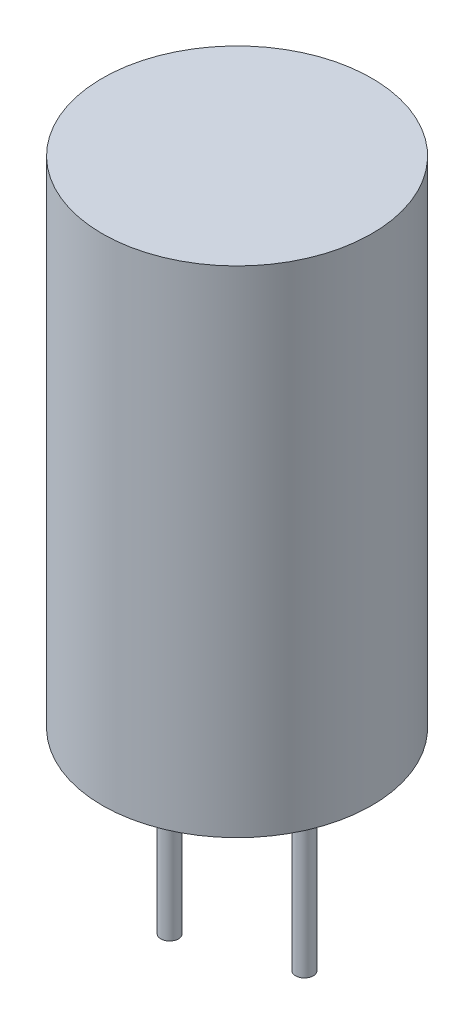
ISO-10303-21;
HEADER;
FILE_DESCRIPTION(('STEP AP214'),'2;1');
FILE_NAME('part.step','',(''),(''),'','','');
FILE_SCHEMA(('AUTOMOTIVE_DESIGN { 1 0 10303 214 1 1 1 1 }'));
ENDSEC;
DATA;
#1=APPLICATION_CONTEXT('core data for automotive mechanical design processes');
#2=APPLICATION_PROTOCOL_DEFINITION('international standard','automotive_design',2000,#1);
#3=PRODUCT_CONTEXT('',#1,'mechanical');
#4=PRODUCT('Part','Part','',(#3));
#5=PRODUCT_RELATED_PRODUCT_CATEGORY('part','',(#4));
#6=PRODUCT_DEFINITION_FORMATION('','',#4);
#7=PRODUCT_DEFINITION_CONTEXT('part definition',#1,'design');
#8=PRODUCT_DEFINITION('design','',#6,#7);
#9=PRODUCT_DEFINITION_SHAPE('','',#8);
#10=(LENGTH_UNIT() NAMED_UNIT(*) SI_UNIT(.MILLI.,.METRE.));
#11=(NAMED_UNIT(*) PLANE_ANGLE_UNIT() SI_UNIT($,.RADIAN.));
#12=(NAMED_UNIT(*) SI_UNIT($,.STERADIAN.) SOLID_ANGLE_UNIT());
#13=UNCERTAINTY_MEASURE_WITH_UNIT(LENGTH_MEASURE(1.E-05),#10,'distance_accuracy_value','');
#14=(GEOMETRIC_REPRESENTATION_CONTEXT(3) GLOBAL_UNCERTAINTY_ASSIGNED_CONTEXT((#13)) GLOBAL_UNIT_ASSIGNED_CONTEXT((#10,
#11,#12)) REPRESENTATION_CONTEXT('',''));
#15=CARTESIAN_POINT('',(0.,0.,0.));
#16=DIRECTION('',(0.,0.,1.));
#17=DIRECTION('',(1.,0.,0.));
#18=AXIS2_PLACEMENT_3D('',#15,#16,#17);
#19=CARTESIAN_POINT('',(0.,0.,0.));
#20=DIRECTION('',(0.,1.,0.));
#21=DIRECTION('',(0.,0.,1.));
#22=AXIS2_PLACEMENT_3D('',#19,#20,#21);
#23=PLANE('',#22);
#24=CARTESIAN_POINT('',(-3.81,0.,0.));
#25=DIRECTION('',(0.,1.,0.));
#26=DIRECTION('',(0.,0.,1.));
#27=AXIS2_PLACEMENT_3D('',#24,#25,#26);
#28=CIRCLE('',#27,0.499999999999999);
#29=CARTESIAN_POINT('',(-3.81,0.,0.499999999999999));
#30=VERTEX_POINT('',#29);
#31=EDGE_CURVE('E34',#30,#30,#28,.F.);
#32=ORIENTED_EDGE('',*,*,#31,.F.);
#33=EDGE_LOOP('',(#32));
#34=FACE_BOUND('',#33,.T.);
#35=CARTESIAN_POINT('',(0.,0.,0.));
#36=DIRECTION('',(0.,1.,0.));
#37=DIRECTION('',(0.,0.,1.));
#38=AXIS2_PLACEMENT_3D('',#35,#36,#37);
#39=CIRCLE('',#38,7.62);
#40=CARTESIAN_POINT('',(0.,0.,7.62));
#41=VERTEX_POINT('',#40);
#42=EDGE_CURVE('E42',#41,#41,#39,.T.);
#43=ORIENTED_EDGE('',*,*,#42,.F.);
#44=EDGE_LOOP('',(#43));
#45=FACE_BOUND('',#44,.T.);
#46=CARTESIAN_POINT('',(3.81,0.,0.));
#47=DIRECTION('',(0.,1.,0.));
#48=DIRECTION('',(0.,0.,1.));
#49=AXIS2_PLACEMENT_3D('',#46,#47,#48);
#50=CIRCLE('',#49,0.500000000000001);
#51=CARTESIAN_POINT('',(3.81,0.,0.5));
#52=VERTEX_POINT('',#51);
#53=EDGE_CURVE('E10',#52,#52,#50,.F.);
#54=ORIENTED_EDGE('',*,*,#53,.F.);
#55=EDGE_LOOP('',(#54));
#56=FACE_BOUND('',#55,.T.);
#57=ADVANCED_FACE('F27',(#34,#45,#56),#23,.F.);
#58=CARTESIAN_POINT('',(0.,28.,0.));
#59=DIRECTION('',(0.,-1.,0.));
#60=DIRECTION('',(0.,0.,-1.));
#61=AXIS2_PLACEMENT_3D('',#58,#59,#60);
#62=CYLINDRICAL_SURFACE('',#61,7.62);
#63=CARTESIAN_POINT('',(0.,28.,0.));
#64=DIRECTION('',(0.,1.,0.));
#65=DIRECTION('',(0.,0.,1.));
#66=AXIS2_PLACEMENT_3D('',#63,#64,#65);
#67=CIRCLE('',#66,7.62);
#68=CARTESIAN_POINT('',(0.,28.,7.62));
#69=VERTEX_POINT('',#68);
#70=EDGE_CURVE('E38',#69,#69,#67,.T.);
#71=ORIENTED_EDGE('',*,*,#70,.F.);
#72=EDGE_LOOP('',(#71));
#73=FACE_BOUND('',#72,.T.);
#74=ORIENTED_EDGE('',*,*,#42,.T.);
#75=EDGE_LOOP('',(#74));
#76=FACE_BOUND('',#75,.T.);
#77=ADVANCED_FACE('F29',(#73,#76),#62,.T.);
#78=CARTESIAN_POINT('',(0.,28.,0.));
#79=DIRECTION('',(0.,1.,0.));
#80=DIRECTION('',(0.,0.,1.));
#81=AXIS2_PLACEMENT_3D('',#78,#79,#80);
#82=PLANE('',#81);
#83=ORIENTED_EDGE('',*,*,#70,.T.);
#84=EDGE_LOOP('',(#83));
#85=FACE_BOUND('',#84,.T.);
#86=ADVANCED_FACE('F74',(#85),#82,.T.);
#87=CARTESIAN_POINT('',(-3.81,-12.,0.));
#88=DIRECTION('',(0.,1.,0.));
#89=DIRECTION('',(0.,0.,1.));
#90=AXIS2_PLACEMENT_3D('',#87,#88,#89);
#91=CYLINDRICAL_SURFACE('',#90,0.499999999999999);
#92=CARTESIAN_POINT('',(-3.81,-12.,0.));
#93=DIRECTION('',(0.,-1.,0.));
#94=DIRECTION('',(0.,0.,-1.));
#95=AXIS2_PLACEMENT_3D('',#92,#93,#94);
#96=CIRCLE('',#95,0.499999999999999);
#97=CARTESIAN_POINT('',(-3.81,-12.,-0.499999999999999));
#98=VERTEX_POINT('',#97);
#99=EDGE_CURVE('E47',#98,#98,#96,.T.);
#100=ORIENTED_EDGE('',*,*,#99,.F.);
#101=EDGE_LOOP('',(#100));
#102=FACE_BOUND('',#101,.T.);
#103=ORIENTED_EDGE('',*,*,#31,.T.);
#104=EDGE_LOOP('',(#103));
#105=FACE_BOUND('',#104,.T.);
#106=ADVANCED_FACE('F66',(#102,#105),#91,.T.);
#107=CARTESIAN_POINT('',(-3.81,-12.,0.));
#108=DIRECTION('',(0.,-1.,0.));
#109=DIRECTION('',(0.,0.,-1.));
#110=AXIS2_PLACEMENT_3D('',#107,#108,#109);
#111=PLANE('',#110);
#112=ORIENTED_EDGE('',*,*,#99,.T.);
#113=EDGE_LOOP('',(#112));
#114=FACE_BOUND('',#113,.T.);
#115=ADVANCED_FACE('F58',(#114),#111,.T.);
#116=CARTESIAN_POINT('',(3.81,-10.,0.));
#117=DIRECTION('',(0.,1.,0.));
#118=DIRECTION('',(0.,0.,1.));
#119=AXIS2_PLACEMENT_3D('',#116,#117,#118);
#120=CYLINDRICAL_SURFACE('',#119,0.500000000000001);
#121=CARTESIAN_POINT('',(3.81,-10.,0.));
#122=DIRECTION('',(0.,-1.,0.));
#123=DIRECTION('',(0.,0.,-1.));
#124=AXIS2_PLACEMENT_3D('',#121,#122,#123);
#125=CIRCLE('',#124,0.500000000000001);
#126=CARTESIAN_POINT('',(3.81,-10.,-0.500000000000001));
#127=VERTEX_POINT('',#126);
#128=EDGE_CURVE('E50',#127,#127,#125,.T.);
#129=ORIENTED_EDGE('',*,*,#128,.F.);
#130=EDGE_LOOP('',(#129));
#131=FACE_BOUND('',#130,.T.);
#132=ORIENTED_EDGE('',*,*,#53,.T.);
#133=EDGE_LOOP('',(#132));
#134=FACE_BOUND('',#133,.T.);
#135=ADVANCED_FACE('F56',(#131,#134),#120,.T.);
#136=CARTESIAN_POINT('',(3.81,-10.,0.));
#137=DIRECTION('',(0.,-1.,0.));
#138=DIRECTION('',(0.,0.,-1.));
#139=AXIS2_PLACEMENT_3D('',#136,#137,#138);
#140=PLANE('',#139);
#141=ORIENTED_EDGE('',*,*,#128,.T.);
#142=EDGE_LOOP('',(#141));
#143=FACE_BOUND('',#142,.T.);
#144=ADVANCED_FACE('F54',(#143),#140,.T.);
#145=CLOSED_SHELL('',(#57,#77,#86,#106,#115,#135,#144));
#146=MANIFOLD_SOLID_BREP('B2',#145);
#147=ADVANCED_BREP_SHAPE_REPRESENTATION('',(#18,#146),#14);
#148=SHAPE_DEFINITION_REPRESENTATION(#9,#147);
ENDSEC;
END-ISO-10303-21;
